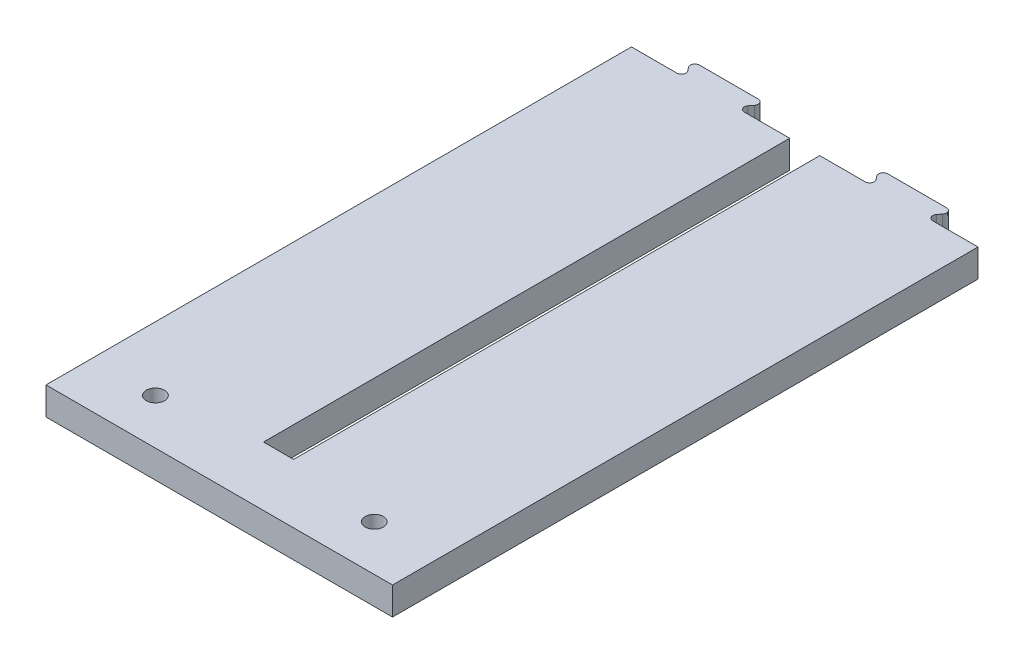
ISO-10303-21;
HEADER;
FILE_DESCRIPTION(('STEP AP214'),'2;1');
FILE_NAME('part.step','',(''),(''),'','','');
FILE_SCHEMA(('AUTOMOTIVE_DESIGN { 1 0 10303 214 1 1 1 1 }'));
ENDSEC;
DATA;
#1=APPLICATION_CONTEXT('core data for automotive mechanical design processes');
#2=APPLICATION_PROTOCOL_DEFINITION('international standard','automotive_design',2000,#1);
#3=PRODUCT_CONTEXT('',#1,'mechanical');
#4=PRODUCT('Part','Part','',(#3));
#5=PRODUCT_RELATED_PRODUCT_CATEGORY('part','',(#4));
#6=PRODUCT_DEFINITION_FORMATION('','',#4);
#7=PRODUCT_DEFINITION_CONTEXT('part definition',#1,'design');
#8=PRODUCT_DEFINITION('design','',#6,#7);
#9=PRODUCT_DEFINITION_SHAPE('','',#8);
#10=(LENGTH_UNIT() NAMED_UNIT(*) SI_UNIT(.MILLI.,.METRE.));
#11=(NAMED_UNIT(*) PLANE_ANGLE_UNIT() SI_UNIT($,.RADIAN.));
#12=(NAMED_UNIT(*) SI_UNIT($,.STERADIAN.) SOLID_ANGLE_UNIT());
#13=UNCERTAINTY_MEASURE_WITH_UNIT(LENGTH_MEASURE(1.E-05),#10,'distance_accuracy_value','');
#14=(GEOMETRIC_REPRESENTATION_CONTEXT(3) GLOBAL_UNCERTAINTY_ASSIGNED_CONTEXT((#13)) GLOBAL_UNIT_ASSIGNED_CONTEXT((#10,
#11,#12)) REPRESENTATION_CONTEXT('',''));
#15=CARTESIAN_POINT('',(0.,0.,0.));
#16=DIRECTION('',(0.,0.,1.));
#17=DIRECTION('',(1.,0.,0.));
#18=AXIS2_PLACEMENT_3D('',#15,#16,#17);
#19=CARTESIAN_POINT('',(-19.,0.,-64.2));
#20=DIRECTION('',(0.,0.,1.));
#21=DIRECTION('',(1.,0.,0.));
#22=AXIS2_PLACEMENT_3D('',#19,#20,#21);
#23=PLANE('',#22);
#24=DIRECTION('',(1.,0.,0.));
#25=VECTOR('',#24,1.);
#26=CARTESIAN_POINT('',(-19.,0.,-64.2));
#27=LINE('',#26,#25);
#28=CARTESIAN_POINT('',(14.0301767927264,0.,-64.2));
#29=VERTEX_POINT('',#28);
#30=CARTESIAN_POINT('',(19.,0.,-64.2));
#31=VERTEX_POINT('',#30);
#32=EDGE_CURVE('E391',#29,#31,#27,.T.);
#33=ORIENTED_EDGE('',*,*,#32,.F.);
#34=DIRECTION('',(0.,1.,0.));
#35=VECTOR('',#34,1.);
#36=CARTESIAN_POINT('',(14.0301767927264,3.05,-64.2));
#37=LINE('',#36,#35);
#38=CARTESIAN_POINT('',(14.0301767927264,3.05,-64.2));
#39=VERTEX_POINT('',#38);
#40=EDGE_CURVE('E285',#29,#39,#37,.T.);
#41=ORIENTED_EDGE('',*,*,#40,.T.);
#42=DIRECTION('',(1.,0.,0.));
#43=VECTOR('',#42,1.);
#44=CARTESIAN_POINT('',(-19.,3.05,-64.2));
#45=LINE('',#44,#43);
#46=CARTESIAN_POINT('',(19.,3.05,-64.2));
#47=VERTEX_POINT('',#46);
#48=EDGE_CURVE('E403',#39,#47,#45,.T.);
#49=ORIENTED_EDGE('',*,*,#48,.T.);
#50=DIRECTION('',(0.,1.,0.));
#51=VECTOR('',#50,1.);
#52=CARTESIAN_POINT('',(19.,0.,-64.2));
#53=LINE('',#52,#51);
#54=EDGE_CURVE('E253',#31,#47,#53,.T.);
#55=ORIENTED_EDGE('',*,*,#54,.F.);
#56=EDGE_LOOP('',(#33,#41,#49,#55));
#57=FACE_BOUND('',#56,.T.);
#58=ADVANCED_FACE('F69',(#57),#23,.F.);
#59=CARTESIAN_POINT('',(1.65,3.05,-64.2));
#60=VERTEX_POINT('',#59);
#61=CARTESIAN_POINT('',(6.61982320727361,3.05,-64.2));
#62=VERTEX_POINT('',#61);
#63=EDGE_CURVE('E394',#60,#62,#45,.T.);
#64=ORIENTED_EDGE('',*,*,#63,.T.);
#65=DIRECTION('',(0.,1.,0.));
#66=VECTOR('',#65,1.);
#67=CARTESIAN_POINT('',(6.61982320727361,0.,-64.2));
#68=LINE('',#67,#66);
#69=CARTESIAN_POINT('',(6.61982320727361,0.,-64.2));
#70=VERTEX_POINT('',#69);
#71=EDGE_CURVE('E344',#62,#70,#68,.F.);
#72=ORIENTED_EDGE('',*,*,#71,.T.);
#73=CARTESIAN_POINT('',(1.65,0.,-64.2));
#74=VERTEX_POINT('',#73);
#75=EDGE_CURVE('E244',#74,#70,#27,.T.);
#76=ORIENTED_EDGE('',*,*,#75,.F.);
#77=DIRECTION('',(0.,-1.,0.));
#78=VECTOR('',#77,1.);
#79=CARTESIAN_POINT('',(1.65,0.,-64.2));
#80=LINE('',#79,#78);
#81=EDGE_CURVE('E281',#60,#74,#80,.T.);
#82=ORIENTED_EDGE('',*,*,#81,.F.);
#83=EDGE_LOOP('',(#64,#72,#76,#82));
#84=FACE_BOUND('',#83,.T.);
#85=ADVANCED_FACE('F540',(#84),#23,.F.);
#86=CARTESIAN_POINT('',(-6.61982320727362,0.,-64.2));
#87=VERTEX_POINT('',#86);
#88=CARTESIAN_POINT('',(-1.65,0.,-64.2));
#89=VERTEX_POINT('',#88);
#90=EDGE_CURVE('E242',#87,#89,#27,.T.);
#91=ORIENTED_EDGE('',*,*,#90,.F.);
#92=DIRECTION('',(0.,1.,0.));
#93=VECTOR('',#92,1.);
#94=CARTESIAN_POINT('',(-6.61982320727362,3.05,-64.2));
#95=LINE('',#94,#93);
#96=CARTESIAN_POINT('',(-6.61982320727362,3.05,-64.2));
#97=VERTEX_POINT('',#96);
#98=EDGE_CURVE('E296',#87,#97,#95,.T.);
#99=ORIENTED_EDGE('',*,*,#98,.T.);
#100=CARTESIAN_POINT('',(-1.65,3.05,-64.2));
#101=VERTEX_POINT('',#100);
#102=EDGE_CURVE('E392',#97,#101,#45,.T.);
#103=ORIENTED_EDGE('',*,*,#102,.T.);
#104=DIRECTION('',(0.,1.,0.));
#105=VECTOR('',#104,1.);
#106=CARTESIAN_POINT('',(-1.65,0.,-64.2));
#107=LINE('',#106,#105);
#108=EDGE_CURVE('E426',#89,#101,#107,.T.);
#109=ORIENTED_EDGE('',*,*,#108,.F.);
#110=EDGE_LOOP('',(#91,#99,#103,#109));
#111=FACE_BOUND('',#110,.T.);
#112=ADVANCED_FACE('F529',(#111),#23,.F.);
#113=CARTESIAN_POINT('',(-19.,3.05,-64.2));
#114=VERTEX_POINT('',#113);
#115=CARTESIAN_POINT('',(-14.0301767927264,3.05,-64.2));
#116=VERTEX_POINT('',#115);
#117=EDGE_CURVE('E385',#114,#116,#45,.T.);
#118=ORIENTED_EDGE('',*,*,#117,.T.);
#119=DIRECTION('',(0.,1.,0.));
#120=VECTOR('',#119,1.);
#121=CARTESIAN_POINT('',(-14.0301767927264,0.,-64.2));
#122=LINE('',#121,#120);
#123=CARTESIAN_POINT('',(-14.0301767927264,0.,-64.2));
#124=VERTEX_POINT('',#123);
#125=EDGE_CURVE('E238',#116,#124,#122,.F.);
#126=ORIENTED_EDGE('',*,*,#125,.T.);
#127=CARTESIAN_POINT('',(-19.,0.,-64.2));
#128=VERTEX_POINT('',#127);
#129=EDGE_CURVE('E231',#128,#124,#27,.T.);
#130=ORIENTED_EDGE('',*,*,#129,.F.);
#131=DIRECTION('',(0.,1.,0.));
#132=VECTOR('',#131,1.);
#133=CARTESIAN_POINT('',(-19.,0.,-64.2));
#134=LINE('',#133,#132);
#135=EDGE_CURVE('E235',#128,#114,#134,.T.);
#136=ORIENTED_EDGE('',*,*,#135,.T.);
#137=EDGE_LOOP('',(#118,#126,#130,#136));
#138=FACE_BOUND('',#137,.T.);
#139=ADVANCED_FACE('F234',(#138),#23,.F.);
#140=CARTESIAN_POINT('',(0.,3.05,0.));
#141=DIRECTION('',(0.,1.,0.));
#142=DIRECTION('',(0.,0.,1.));
#143=AXIS2_PLACEMENT_3D('',#140,#141,#142);
#144=PLANE('',#143);
#145=DIRECTION('',(-0.618688597809045,0.,0.785636314678159));
#146=VECTOR('',#145,1.);
#147=CARTESIAN_POINT('',(-23.1814061143793,3.05,-18.2553573150735));
#148=LINE('',#147,#146);
#149=CARTESIAN_POINT('',(13.9376413646127,3.05,-65.3906557010955));
#150=VERTEX_POINT('',#149);
#151=CARTESIAN_POINT('',(13.6373586353873,3.05,-65.0093442989045));
#152=VERTEX_POINT('',#151);
#153=EDGE_CURVE('E497',#150,#152,#148,.T.);
#154=ORIENTED_EDGE('',*,*,#153,.F.);
#155=CARTESIAN_POINT('',(13.5448232072736,3.05,-65.7));
#156=DIRECTION('',(0.,1.,0.));
#157=DIRECTION('',(0.,0.,1.));
#158=AXIS2_PLACEMENT_3D('',#155,#156,#157);
#159=CIRCLE('',#158,0.5);
#160=CARTESIAN_POINT('',(13.5448232072736,3.05,-66.2));
#161=VERTEX_POINT('',#160);
#162=EDGE_CURVE('E316',#150,#161,#159,.T.);
#163=ORIENTED_EDGE('',*,*,#162,.T.);
#164=DIRECTION('',(1.,0.,0.));
#165=VECTOR('',#164,1.);
#166=CARTESIAN_POINT('',(0.,3.05,-66.2));
#167=LINE('',#166,#165);
#168=CARTESIAN_POINT('',(7.10517679272638,3.05,-66.2));
#169=VERTEX_POINT('',#168);
#170=EDGE_CURVE('E504',#169,#161,#167,.T.);
#171=ORIENTED_EDGE('',*,*,#170,.F.);
#172=CARTESIAN_POINT('',(7.10517679272638,3.05,-65.7));
#173=DIRECTION('',(0.,1.,0.));
#174=DIRECTION('',(0.,0.,1.));
#175=AXIS2_PLACEMENT_3D('',#172,#173,#174);
#176=CIRCLE('',#175,0.5);
#177=CARTESIAN_POINT('',(6.7123586353873,3.05,-65.3906557010955));
#178=VERTEX_POINT('',#177);
#179=EDGE_CURVE('E313',#169,#178,#176,.T.);
#180=ORIENTED_EDGE('',*,*,#179,.T.);
#181=DIRECTION('',(-0.618688597809051,0.,-0.785636314678154));
#182=VECTOR('',#181,1.);
#183=CARTESIAN_POINT('',(35.9270903655126,3.05,-28.2925836628414));
#184=LINE('',#183,#182);
#185=CARTESIAN_POINT('',(7.01264136461267,3.05,-65.0093442989045));
#186=VERTEX_POINT('',#185);
#187=EDGE_CURVE('E508',#186,#178,#184,.T.);
#188=ORIENTED_EDGE('',*,*,#187,.F.);
#189=CARTESIAN_POINT('',(6.61982320727361,3.05,-64.7));
#190=DIRECTION('',(0.,1.,0.));
#191=DIRECTION('',(0.,0.,1.));
#192=AXIS2_PLACEMENT_3D('',#189,#190,#191);
#193=CIRCLE('',#192,0.5);
#194=EDGE_CURVE('E375',#186,#62,#193,.F.);
#195=ORIENTED_EDGE('',*,*,#194,.T.);
#196=ORIENTED_EDGE('',*,*,#63,.F.);
#197=DIRECTION('',(0.,0.,-1.));
#198=VECTOR('',#197,1.);
#199=CARTESIAN_POINT('',(1.65,3.05,0.));
#200=LINE('',#199,#198);
#201=CARTESIAN_POINT('',(1.65,3.05,-6.5));
#202=VERTEX_POINT('',#201);
#203=EDGE_CURVE('E463',#202,#60,#200,.T.);
#204=ORIENTED_EDGE('',*,*,#203,.F.);
#205=DIRECTION('',(1.,0.,0.));
#206=VECTOR('',#205,1.);
#207=CARTESIAN_POINT('',(0.,3.05,-6.5));
#208=LINE('',#207,#206);
#209=CARTESIAN_POINT('',(-1.65,3.05,-6.5));
#210=VERTEX_POINT('',#209);
#211=EDGE_CURVE('E436',#210,#202,#208,.T.);
#212=ORIENTED_EDGE('',*,*,#211,.F.);
#213=DIRECTION('',(0.,0.,1.));
#214=VECTOR('',#213,1.);
#215=CARTESIAN_POINT('',(-1.65,3.05,0.));
#216=LINE('',#215,#214);
#217=EDGE_CURVE('E453',#101,#210,#216,.T.);
#218=ORIENTED_EDGE('',*,*,#217,.F.);
#219=ORIENTED_EDGE('',*,*,#102,.F.);
#220=CARTESIAN_POINT('',(-6.61982320727362,3.05,-64.7));
#221=DIRECTION('',(0.,1.,0.));
#222=DIRECTION('',(0.,0.,1.));
#223=AXIS2_PLACEMENT_3D('',#220,#221,#222);
#224=CIRCLE('',#223,0.5);
#225=CARTESIAN_POINT('',(-7.0126413646127,3.05,-65.0093442989045));
#226=VERTEX_POINT('',#225);
#227=EDGE_CURVE('E369',#97,#226,#224,.F.);
#228=ORIENTED_EDGE('',*,*,#227,.T.);
#229=DIRECTION('',(-0.618688597809045,0.,0.785636314678159));
#230=VECTOR('',#229,1.);
#231=CARTESIAN_POINT('',(-35.9270903655126,3.05,-28.2925836628409));
#232=LINE('',#231,#230);
#233=CARTESIAN_POINT('',(-6.71235863538732,3.05,-65.3906557010955));
#234=VERTEX_POINT('',#233);
#235=EDGE_CURVE('E413',#234,#226,#232,.T.);
#236=ORIENTED_EDGE('',*,*,#235,.F.);
#237=CARTESIAN_POINT('',(-7.10517679272641,3.05,-65.7));
#238=DIRECTION('',(0.,1.,0.));
#239=DIRECTION('',(0.,0.,1.));
#240=AXIS2_PLACEMENT_3D('',#237,#238,#239);
#241=CIRCLE('',#240,0.5);
#242=CARTESIAN_POINT('',(-7.10517679272641,3.05,-66.2));
#243=VERTEX_POINT('',#242);
#244=EDGE_CURVE('E310',#234,#243,#241,.T.);
#245=ORIENTED_EDGE('',*,*,#244,.T.);
#246=DIRECTION('',(1.,0.,0.));
#247=VECTOR('',#246,1.);
#248=CARTESIAN_POINT('',(0.,3.05,-66.2));
#249=LINE('',#248,#247);
#250=CARTESIAN_POINT('',(-13.5448232072736,3.05,-66.2));
#251=VERTEX_POINT('',#250);
#252=EDGE_CURVE('E417',#251,#243,#249,.T.);
#253=ORIENTED_EDGE('',*,*,#252,.F.);
#254=CARTESIAN_POINT('',(-13.5448232072736,3.05,-65.7));
#255=DIRECTION('',(0.,1.,0.));
#256=DIRECTION('',(0.,0.,1.));
#257=AXIS2_PLACEMENT_3D('',#254,#255,#256);
#258=CIRCLE('',#257,0.5);
#259=CARTESIAN_POINT('',(-13.9376413646127,3.05,-65.3906557010955));
#260=VERTEX_POINT('',#259);
#261=EDGE_CURVE('E307',#251,#260,#258,.T.);
#262=ORIENTED_EDGE('',*,*,#261,.T.);
#263=DIRECTION('',(-0.618688597809045,0.,-0.785636314678159));
#264=VECTOR('',#263,1.);
#265=CARTESIAN_POINT('',(23.1814061143793,3.05,-18.2553573150735));
#266=LINE('',#265,#264);
#267=CARTESIAN_POINT('',(-13.6373586353873,3.05,-65.0093442989045));
#268=VERTEX_POINT('',#267);
#269=EDGE_CURVE('E387',#268,#260,#266,.T.);
#270=ORIENTED_EDGE('',*,*,#269,.F.);
#271=CARTESIAN_POINT('',(-14.0301767927264,3.05,-64.7));
#272=DIRECTION('',(0.,1.,0.));
#273=DIRECTION('',(0.,0.,1.));
#274=AXIS2_PLACEMENT_3D('',#271,#272,#273);
#275=CIRCLE('',#274,0.5);
#276=EDGE_CURVE('E78',#268,#116,#275,.F.);
#277=ORIENTED_EDGE('',*,*,#276,.T.);
#278=ORIENTED_EDGE('',*,*,#117,.F.);
#279=DIRECTION('',(0.,0.,-1.));
#280=VECTOR('',#279,1.);
#281=CARTESIAN_POINT('',(-19.,3.05,0.));
#282=LINE('',#281,#280);
#283=CARTESIAN_POINT('',(-19.,3.05,0.));
#284=VERTEX_POINT('',#283);
#285=EDGE_CURVE('E251',#284,#114,#282,.T.);
#286=ORIENTED_EDGE('',*,*,#285,.F.);
#287=DIRECTION('',(1.,0.,0.));
#288=VECTOR('',#287,1.);
#289=CARTESIAN_POINT('',(0.,3.05,0.));
#290=LINE('',#289,#288);
#291=CARTESIAN_POINT('',(19.,3.05,0.));
#292=VERTEX_POINT('',#291);
#293=EDGE_CURVE('E262',#284,#292,#290,.T.);
#294=ORIENTED_EDGE('',*,*,#293,.T.);
#295=DIRECTION('',(0.,0.,-1.));
#296=VECTOR('',#295,1.);
#297=CARTESIAN_POINT('',(19.,3.05,0.));
#298=LINE('',#297,#296);
#299=EDGE_CURVE('E268',#292,#47,#298,.T.);
#300=ORIENTED_EDGE('',*,*,#299,.T.);
#301=ORIENTED_EDGE('',*,*,#48,.F.);
#302=CARTESIAN_POINT('',(14.0301767927264,3.05,-64.7));
#303=DIRECTION('',(0.,1.,0.));
#304=DIRECTION('',(0.,0.,1.));
#305=AXIS2_PLACEMENT_3D('',#302,#303,#304);
#306=CIRCLE('',#305,0.5);
#307=EDGE_CURVE('E363',#39,#152,#306,.F.);
#308=ORIENTED_EDGE('',*,*,#307,.T.);
#309=EDGE_LOOP('',(#154,#163,#171,#180,#188,#195,#196,#204,#212,#218,#219,#228,#236,#245,#253,
#262,#270,#277,#278,#286,#294,#300,#301,#308));
#310=FACE_BOUND('',#309,.T.);
#311=CARTESIAN_POINT('',(12.,3.05,-5.));
#312=DIRECTION('',(0.,-1.,0.));
#313=DIRECTION('',(0.,0.,-1.));
#314=AXIS2_PLACEMENT_3D('',#311,#312,#313);
#315=CIRCLE('',#314,1.);
#316=CARTESIAN_POINT('',(12.,3.05,-6.));
#317=VERTEX_POINT('',#316);
#318=EDGE_CURVE('E441',#317,#317,#315,.T.);
#319=ORIENTED_EDGE('',*,*,#318,.T.);
#320=EDGE_LOOP('',(#319));
#321=FACE_BOUND('',#320,.T.);
#322=CARTESIAN_POINT('',(-12.,3.05,-5.));
#323=DIRECTION('',(0.,1.,0.));
#324=DIRECTION('',(0.,0.,1.));
#325=AXIS2_PLACEMENT_3D('',#322,#323,#324);
#326=CIRCLE('',#325,1.);
#327=CARTESIAN_POINT('',(-12.,3.05,-4.));
#328=VERTEX_POINT('',#327);
#329=EDGE_CURVE('E437',#328,#328,#326,.T.);
#330=ORIENTED_EDGE('',*,*,#329,.F.);
#331=EDGE_LOOP('',(#330));
#332=FACE_BOUND('',#331,.T.);
#333=ADVANCED_FACE('F383',(#310,#321,#332),#144,.T.);
#334=CARTESIAN_POINT('',(0.,0.,0.));
#335=DIRECTION('',(0.,1.,0.));
#336=DIRECTION('',(0.,0.,1.));
#337=AXIS2_PLACEMENT_3D('',#334,#335,#336);
#338=PLANE('',#337);
#339=DIRECTION('',(1.,0.,0.));
#340=VECTOR('',#339,1.);
#341=CARTESIAN_POINT('',(0.,0.,-66.2));
#342=LINE('',#341,#340);
#343=CARTESIAN_POINT('',(7.10517679272638,0.,-66.2));
#344=VERTEX_POINT('',#343);
#345=CARTESIAN_POINT('',(13.5448232072736,0.,-66.2));
#346=VERTEX_POINT('',#345);
#347=EDGE_CURVE('E556',#344,#346,#342,.T.);
#348=ORIENTED_EDGE('',*,*,#347,.T.);
#349=CARTESIAN_POINT('',(13.5448232072736,0.,-65.7));
#350=DIRECTION('',(0.,1.,0.));
#351=DIRECTION('',(0.,0.,1.));
#352=AXIS2_PLACEMENT_3D('',#349,#350,#351);
#353=CIRCLE('',#352,0.5);
#354=CARTESIAN_POINT('',(13.9376413646127,0.,-65.3906557010955));
#355=VERTEX_POINT('',#354);
#356=EDGE_CURVE('E335',#346,#355,#353,.F.);
#357=ORIENTED_EDGE('',*,*,#356,.T.);
#358=DIRECTION('',(-0.618688597809045,0.,0.785636314678159));
#359=VECTOR('',#358,1.);
#360=CARTESIAN_POINT('',(-23.1814061143793,0.,-18.2553573150735));
#361=LINE('',#360,#359);
#362=CARTESIAN_POINT('',(13.6373586353873,0.,-65.0093442989045));
#363=VERTEX_POINT('',#362);
#364=EDGE_CURVE('E514',#355,#363,#361,.T.);
#365=ORIENTED_EDGE('',*,*,#364,.T.);
#366=CARTESIAN_POINT('',(14.0301767927264,0.,-64.7));
#367=DIRECTION('',(0.,1.,0.));
#368=DIRECTION('',(0.,0.,1.));
#369=AXIS2_PLACEMENT_3D('',#366,#367,#368);
#370=CIRCLE('',#369,0.5);
#371=EDGE_CURVE('E366',#363,#29,#370,.T.);
#372=ORIENTED_EDGE('',*,*,#371,.T.);
#373=ORIENTED_EDGE('',*,*,#32,.T.);
#374=DIRECTION('',(0.,0.,-1.));
#375=VECTOR('',#374,1.);
#376=CARTESIAN_POINT('',(19.,0.,0.));
#377=LINE('',#376,#375);
#378=CARTESIAN_POINT('',(19.,0.,0.));
#379=VERTEX_POINT('',#378);
#380=EDGE_CURVE('E263',#379,#31,#377,.T.);
#381=ORIENTED_EDGE('',*,*,#380,.F.);
#382=DIRECTION('',(1.,0.,0.));
#383=VECTOR('',#382,1.);
#384=CARTESIAN_POINT('',(0.,0.,0.));
#385=LINE('',#384,#383);
#386=CARTESIAN_POINT('',(-19.,0.,0.));
#387=VERTEX_POINT('',#386);
#388=EDGE_CURVE('E260',#387,#379,#385,.T.);
#389=ORIENTED_EDGE('',*,*,#388,.F.);
#390=DIRECTION('',(0.,0.,-1.));
#391=VECTOR('',#390,1.);
#392=CARTESIAN_POINT('',(-19.,0.,0.));
#393=LINE('',#392,#391);
#394=EDGE_CURVE('E249',#387,#128,#393,.T.);
#395=ORIENTED_EDGE('',*,*,#394,.T.);
#396=ORIENTED_EDGE('',*,*,#129,.T.);
#397=CARTESIAN_POINT('',(-14.0301767927264,0.,-64.7));
#398=DIRECTION('',(0.,1.,0.));
#399=DIRECTION('',(0.,0.,1.));
#400=AXIS2_PLACEMENT_3D('',#397,#398,#399);
#401=CIRCLE('',#400,0.5);
#402=CARTESIAN_POINT('',(-13.6373586353873,0.,-65.0093442989045));
#403=VERTEX_POINT('',#402);
#404=EDGE_CURVE('E12',#124,#403,#401,.T.);
#405=ORIENTED_EDGE('',*,*,#404,.T.);
#406=DIRECTION('',(-0.618688597809045,0.,-0.785636314678159));
#407=VECTOR('',#406,1.);
#408=CARTESIAN_POINT('',(23.1814061143793,0.,-18.2553573150735));
#409=LINE('',#408,#407);
#410=CARTESIAN_POINT('',(-13.9376413646127,0.,-65.3906557010955));
#411=VERTEX_POINT('',#410);
#412=EDGE_CURVE('E397',#403,#411,#409,.T.);
#413=ORIENTED_EDGE('',*,*,#412,.T.);
#414=CARTESIAN_POINT('',(-13.5448232072736,0.,-65.7));
#415=DIRECTION('',(0.,1.,0.));
#416=DIRECTION('',(0.,0.,1.));
#417=AXIS2_PLACEMENT_3D('',#414,#415,#416);
#418=CIRCLE('',#417,0.5);
#419=CARTESIAN_POINT('',(-13.5448232072736,0.,-66.2));
#420=VERTEX_POINT('',#419);
#421=EDGE_CURVE('E326',#411,#420,#418,.F.);
#422=ORIENTED_EDGE('',*,*,#421,.T.);
#423=DIRECTION('',(1.,0.,0.));
#424=VECTOR('',#423,1.);
#425=CARTESIAN_POINT('',(0.,0.,-66.2));
#426=LINE('',#425,#424);
#427=CARTESIAN_POINT('',(-7.10517679272641,0.,-66.2));
#428=VERTEX_POINT('',#427);
#429=EDGE_CURVE('E404',#420,#428,#426,.T.);
#430=ORIENTED_EDGE('',*,*,#429,.T.);
#431=CARTESIAN_POINT('',(-7.10517679272641,0.,-65.7));
#432=DIRECTION('',(0.,1.,0.));
#433=DIRECTION('',(0.,0.,1.));
#434=AXIS2_PLACEMENT_3D('',#431,#432,#433);
#435=CIRCLE('',#434,0.5);
#436=CARTESIAN_POINT('',(-6.71235863538732,0.,-65.3906557010955));
#437=VERTEX_POINT('',#436);
#438=EDGE_CURVE('E329',#428,#437,#435,.F.);
#439=ORIENTED_EDGE('',*,*,#438,.T.);
#440=DIRECTION('',(-0.618688597809045,0.,0.785636314678159));
#441=VECTOR('',#440,1.);
#442=CARTESIAN_POINT('',(-35.9270903655126,0.,-28.2925836628409));
#443=LINE('',#442,#441);
#444=CARTESIAN_POINT('',(-7.0126413646127,0.,-65.0093442989045));
#445=VERTEX_POINT('',#444);
#446=EDGE_CURVE('E409',#437,#445,#443,.T.);
#447=ORIENTED_EDGE('',*,*,#446,.T.);
#448=CARTESIAN_POINT('',(-6.61982320727362,0.,-64.7));
#449=DIRECTION('',(0.,1.,0.));
#450=DIRECTION('',(0.,0.,1.));
#451=AXIS2_PLACEMENT_3D('',#448,#449,#450);
#452=CIRCLE('',#451,0.5);
#453=EDGE_CURVE('E372',#445,#87,#452,.T.);
#454=ORIENTED_EDGE('',*,*,#453,.T.);
#455=ORIENTED_EDGE('',*,*,#90,.T.);
#456=DIRECTION('',(0.,0.,1.));
#457=VECTOR('',#456,1.);
#458=CARTESIAN_POINT('',(-1.65,0.,0.));
#459=LINE('',#458,#457);
#460=CARTESIAN_POINT('',(-1.65,0.,-6.5));
#461=VERTEX_POINT('',#460);
#462=EDGE_CURVE('E457',#89,#461,#459,.T.);
#463=ORIENTED_EDGE('',*,*,#462,.T.);
#464=DIRECTION('',(1.,0.,0.));
#465=VECTOR('',#464,1.);
#466=CARTESIAN_POINT('',(0.,0.,-6.5));
#467=LINE('',#466,#465);
#468=CARTESIAN_POINT('',(1.65,0.,-6.5));
#469=VERTEX_POINT('',#468);
#470=EDGE_CURVE('E448',#461,#469,#467,.T.);
#471=ORIENTED_EDGE('',*,*,#470,.T.);
#472=DIRECTION('',(0.,0.,-1.));
#473=VECTOR('',#472,1.);
#474=CARTESIAN_POINT('',(1.65,0.,0.));
#475=LINE('',#474,#473);
#476=EDGE_CURVE('E452',#469,#74,#475,.T.);
#477=ORIENTED_EDGE('',*,*,#476,.T.);
#478=ORIENTED_EDGE('',*,*,#75,.T.);
#479=CARTESIAN_POINT('',(6.61982320727361,0.,-64.7));
#480=DIRECTION('',(0.,1.,0.));
#481=DIRECTION('',(0.,0.,1.));
#482=AXIS2_PLACEMENT_3D('',#479,#480,#481);
#483=CIRCLE('',#482,0.5);
#484=CARTESIAN_POINT('',(7.01264136461267,0.,-65.0093442989045));
#485=VERTEX_POINT('',#484);
#486=EDGE_CURVE('E92',#70,#485,#483,.T.);
#487=ORIENTED_EDGE('',*,*,#486,.T.);
#488=DIRECTION('',(-0.618688597809051,0.,-0.785636314678154));
#489=VECTOR('',#488,1.);
#490=CARTESIAN_POINT('',(35.9270903655126,0.,-28.2925836628414));
#491=LINE('',#490,#489);
#492=CARTESIAN_POINT('',(6.7123586353873,0.,-65.3906557010955));
#493=VERTEX_POINT('',#492);
#494=EDGE_CURVE('E418',#485,#493,#491,.T.);
#495=ORIENTED_EDGE('',*,*,#494,.T.);
#496=CARTESIAN_POINT('',(7.10517679272638,0.,-65.7));
#497=DIRECTION('',(0.,1.,0.));
#498=DIRECTION('',(0.,0.,1.));
#499=AXIS2_PLACEMENT_3D('',#496,#497,#498);
#500=CIRCLE('',#499,0.5);
#501=EDGE_CURVE('E332',#493,#344,#500,.F.);
#502=ORIENTED_EDGE('',*,*,#501,.T.);
#503=EDGE_LOOP('',(#348,#357,#365,#372,#373,#381,#389,#395,#396,#405,#413,#422,#430,#439,#447,
#454,#455,#463,#471,#477,#478,#487,#495,#502));
#504=FACE_BOUND('',#503,.T.);
#505=CARTESIAN_POINT('',(12.,0.,-5.));
#506=DIRECTION('',(0.,-1.,0.));
#507=DIRECTION('',(0.,0.,-1.));
#508=AXIS2_PLACEMENT_3D('',#505,#506,#507);
#509=CIRCLE('',#508,1.);
#510=CARTESIAN_POINT('',(12.,0.,-6.));
#511=VERTEX_POINT('',#510);
#512=EDGE_CURVE('E431',#511,#511,#509,.T.);
#513=ORIENTED_EDGE('',*,*,#512,.F.);
#514=EDGE_LOOP('',(#513));
#515=FACE_BOUND('',#514,.T.);
#516=CARTESIAN_POINT('',(-12.,0.,-5.));
#517=DIRECTION('',(0.,1.,0.));
#518=DIRECTION('',(0.,0.,1.));
#519=AXIS2_PLACEMENT_3D('',#516,#517,#518);
#520=CIRCLE('',#519,1.);
#521=CARTESIAN_POINT('',(-12.,0.,-4.));
#522=VERTEX_POINT('',#521);
#523=EDGE_CURVE('E432',#522,#522,#520,.T.);
#524=ORIENTED_EDGE('',*,*,#523,.T.);
#525=EDGE_LOOP('',(#524));
#526=FACE_BOUND('',#525,.T.);
#527=ADVANCED_FACE('F257',(#504,#515,#526),#338,.F.);
#528=CARTESIAN_POINT('',(0.,3.05,0.));
#529=DIRECTION('',(0.,0.,-1.));
#530=DIRECTION('',(-1.,0.,0.));
#531=AXIS2_PLACEMENT_3D('',#528,#529,#530);
#532=PLANE('',#531);
#533=ORIENTED_EDGE('',*,*,#388,.T.);
#534=DIRECTION('',(0.,-1.,0.));
#535=VECTOR('',#534,1.);
#536=CARTESIAN_POINT('',(19.,3.05,0.));
#537=LINE('',#536,#535);
#538=EDGE_CURVE('E277',#292,#379,#537,.T.);
#539=ORIENTED_EDGE('',*,*,#538,.F.);
#540=ORIENTED_EDGE('',*,*,#293,.F.);
#541=DIRECTION('',(0.,-1.,0.));
#542=VECTOR('',#541,1.);
#543=CARTESIAN_POINT('',(-19.,3.05,0.));
#544=LINE('',#543,#542);
#545=EDGE_CURVE('E274',#284,#387,#544,.T.);
#546=ORIENTED_EDGE('',*,*,#545,.T.);
#547=EDGE_LOOP('',(#533,#539,#540,#546));
#548=FACE_BOUND('',#547,.T.);
#549=ADVANCED_FACE('F483',(#548),#532,.F.);
#550=CARTESIAN_POINT('',(19.,3.05,0.));
#551=DIRECTION('',(-1.,0.,0.));
#552=DIRECTION('',(0.,0.,1.));
#553=AXIS2_PLACEMENT_3D('',#550,#551,#552);
#554=PLANE('',#553);
#555=ORIENTED_EDGE('',*,*,#380,.T.);
#556=ORIENTED_EDGE('',*,*,#54,.T.);
#557=ORIENTED_EDGE('',*,*,#299,.F.);
#558=ORIENTED_EDGE('',*,*,#538,.T.);
#559=EDGE_LOOP('',(#555,#556,#557,#558));
#560=FACE_BOUND('',#559,.T.);
#561=ADVANCED_FACE('F487',(#560),#554,.F.);
#562=CARTESIAN_POINT('',(-19.,3.05,0.));
#563=DIRECTION('',(-1.,0.,0.));
#564=DIRECTION('',(0.,0.,1.));
#565=AXIS2_PLACEMENT_3D('',#562,#563,#564);
#566=PLANE('',#565);
#567=ORIENTED_EDGE('',*,*,#135,.F.);
#568=ORIENTED_EDGE('',*,*,#394,.F.);
#569=ORIENTED_EDGE('',*,*,#545,.F.);
#570=ORIENTED_EDGE('',*,*,#285,.T.);
#571=EDGE_LOOP('',(#567,#568,#569,#570));
#572=FACE_BOUND('',#571,.T.);
#573=ADVANCED_FACE('F248',(#572),#566,.T.);
#574=CARTESIAN_POINT('',(0.,0.,-6.5));
#575=DIRECTION('',(0.,0.,1.));
#576=DIRECTION('',(1.,0.,0.));
#577=AXIS2_PLACEMENT_3D('',#574,#575,#576);
#578=PLANE('',#577);
#579=ORIENTED_EDGE('',*,*,#211,.T.);
#580=DIRECTION('',(0.,1.,0.));
#581=VECTOR('',#580,1.);
#582=CARTESIAN_POINT('',(1.65,0.,-6.5));
#583=LINE('',#582,#581);
#584=EDGE_CURVE('E460',#469,#202,#583,.T.);
#585=ORIENTED_EDGE('',*,*,#584,.F.);
#586=ORIENTED_EDGE('',*,*,#470,.F.);
#587=DIRECTION('',(0.,1.,0.));
#588=VECTOR('',#587,1.);
#589=CARTESIAN_POINT('',(-1.65,0.,-6.5));
#590=LINE('',#589,#588);
#591=EDGE_CURVE('E469',#461,#210,#590,.T.);
#592=ORIENTED_EDGE('',*,*,#591,.T.);
#593=EDGE_LOOP('',(#579,#585,#586,#592));
#594=FACE_BOUND('',#593,.T.);
#595=ADVANCED_FACE('F592',(#594),#578,.F.);
#596=CARTESIAN_POINT('',(-1.65,0.,0.));
#597=DIRECTION('',(-1.,0.,0.));
#598=DIRECTION('',(0.,0.,1.));
#599=AXIS2_PLACEMENT_3D('',#596,#597,#598);
#600=PLANE('',#599);
#601=ORIENTED_EDGE('',*,*,#462,.F.);
#602=ORIENTED_EDGE('',*,*,#108,.T.);
#603=ORIENTED_EDGE('',*,*,#217,.T.);
#604=ORIENTED_EDGE('',*,*,#591,.F.);
#605=EDGE_LOOP('',(#601,#602,#603,#604));
#606=FACE_BOUND('',#605,.T.);
#607=ADVANCED_FACE('F744',(#606),#600,.F.);
#608=CARTESIAN_POINT('',(1.65,0.,0.));
#609=DIRECTION('',(1.,0.,0.));
#610=DIRECTION('',(0.,0.,-1.));
#611=AXIS2_PLACEMENT_3D('',#608,#609,#610);
#612=PLANE('',#611);
#613=ORIENTED_EDGE('',*,*,#203,.T.);
#614=ORIENTED_EDGE('',*,*,#81,.T.);
#615=ORIENTED_EDGE('',*,*,#476,.F.);
#616=ORIENTED_EDGE('',*,*,#584,.T.);
#617=EDGE_LOOP('',(#613,#614,#615,#616));
#618=FACE_BOUND('',#617,.T.);
#619=ADVANCED_FACE('F739',(#618),#612,.F.);
#620=CARTESIAN_POINT('',(12.,0.,-5.));
#621=DIRECTION('',(0.,1.,0.));
#622=DIRECTION('',(0.,0.,1.));
#623=AXIS2_PLACEMENT_3D('',#620,#621,#622);
#624=CYLINDRICAL_SURFACE('',#623,1.);
#625=ORIENTED_EDGE('',*,*,#512,.T.);
#626=EDGE_LOOP('',(#625));
#627=FACE_BOUND('',#626,.T.);
#628=ORIENTED_EDGE('',*,*,#318,.F.);
#629=EDGE_LOOP('',(#628));
#630=FACE_BOUND('',#629,.T.);
#631=ADVANCED_FACE('F624',(#627,#630),#624,.F.);
#632=CARTESIAN_POINT('',(-12.,0.,-5.));
#633=DIRECTION('',(0.,1.,0.));
#634=DIRECTION('',(0.,0.,1.));
#635=AXIS2_PLACEMENT_3D('',#632,#633,#634);
#636=CYLINDRICAL_SURFACE('',#635,1.);
#637=ORIENTED_EDGE('',*,*,#523,.F.);
#638=EDGE_LOOP('',(#637));
#639=FACE_BOUND('',#638,.T.);
#640=ORIENTED_EDGE('',*,*,#329,.T.);
#641=EDGE_LOOP('',(#640));
#642=FACE_BOUND('',#641,.T.);
#643=ADVANCED_FACE('F620',(#639,#642),#636,.F.);
#644=CARTESIAN_POINT('',(-35.9270903655126,0.,-28.2925836628409));
#645=DIRECTION('',(-0.785636314678158,0.,-0.618688597809044));
#646=DIRECTION('',(-0.618688597809045,0.,0.785636314678159));
#647=AXIS2_PLACEMENT_3D('',#644,#645,#646);
#648=PLANE('',#647);
#649=ORIENTED_EDGE('',*,*,#235,.T.);
#650=DIRECTION('',(0.,1.,0.));
#651=VECTOR('',#650,1.);
#652=CARTESIAN_POINT('',(-7.0126413646127,0.,-65.0093442989045));
#653=LINE('',#652,#651);
#654=EDGE_CURVE('E304',#226,#445,#653,.F.);
#655=ORIENTED_EDGE('',*,*,#654,.T.);
#656=ORIENTED_EDGE('',*,*,#446,.F.);
#657=DIRECTION('',(0.,1.,0.));
#658=VECTOR('',#657,1.);
#659=CARTESIAN_POINT('',(-6.71235863538732,0.,-65.3906557010955));
#660=LINE('',#659,#658);
#661=EDGE_CURVE('E300',#437,#234,#660,.T.);
#662=ORIENTED_EDGE('',*,*,#661,.T.);
#663=EDGE_LOOP('',(#649,#655,#656,#662));
#664=FACE_BOUND('',#663,.T.);
#665=ADVANCED_FACE('F616',(#664),#648,.F.);
#666=CARTESIAN_POINT('',(23.1814061143793,0.,-18.2553573150735));
#667=DIRECTION('',(0.785636314678158,0.,-0.618688597809044));
#668=DIRECTION('',(-0.618688597809045,0.,-0.785636314678159));
#669=AXIS2_PLACEMENT_3D('',#666,#667,#668);
#670=PLANE('',#669);
#671=ORIENTED_EDGE('',*,*,#269,.T.);
#672=DIRECTION('',(0.,1.,0.));
#673=VECTOR('',#672,1.);
#674=CARTESIAN_POINT('',(-13.9376413646127,0.,-65.3906557010955));
#675=LINE('',#674,#673);
#676=EDGE_CURVE('E358',#260,#411,#675,.F.);
#677=ORIENTED_EDGE('',*,*,#676,.T.);
#678=ORIENTED_EDGE('',*,*,#412,.F.);
#679=DIRECTION('',(0.,1.,0.));
#680=VECTOR('',#679,1.);
#681=CARTESIAN_POINT('',(-13.6373586353873,3.05,-65.0093442989045));
#682=LINE('',#681,#680);
#683=EDGE_CURVE('E354',#403,#268,#682,.T.);
#684=ORIENTED_EDGE('',*,*,#683,.T.);
#685=EDGE_LOOP('',(#671,#677,#678,#684));
#686=FACE_BOUND('',#685,.T.);
#687=ADVANCED_FACE('F400',(#686),#670,.F.);
#688=CARTESIAN_POINT('',(0.,0.,-66.2));
#689=DIRECTION('',(0.,0.,1.));
#690=DIRECTION('',(1.,0.,0.));
#691=AXIS2_PLACEMENT_3D('',#688,#689,#690);
#692=PLANE('',#691);
#693=ORIENTED_EDGE('',*,*,#252,.T.);
#694=DIRECTION('',(0.,1.,0.));
#695=VECTOR('',#694,1.);
#696=CARTESIAN_POINT('',(-7.10517679272641,0.,-66.2));
#697=LINE('',#696,#695);
#698=EDGE_CURVE('E351',#243,#428,#697,.F.);
#699=ORIENTED_EDGE('',*,*,#698,.T.);
#700=ORIENTED_EDGE('',*,*,#429,.F.);
#701=DIRECTION('',(0.,1.,0.));
#702=VECTOR('',#701,1.);
#703=CARTESIAN_POINT('',(-13.5448232072736,0.,-66.2));
#704=LINE('',#703,#702);
#705=EDGE_CURVE('E347',#420,#251,#704,.T.);
#706=ORIENTED_EDGE('',*,*,#705,.T.);
#707=EDGE_LOOP('',(#693,#699,#700,#706));
#708=FACE_BOUND('',#707,.T.);
#709=ADVANCED_FACE('F613',(#708),#692,.F.);
#710=CARTESIAN_POINT('',(-23.1814061143793,0.,-18.2553573150735));
#711=DIRECTION('',(-0.785636314678158,0.,-0.618688597809044));
#712=DIRECTION('',(-0.618688597809045,0.,0.785636314678159));
#713=AXIS2_PLACEMENT_3D('',#710,#711,#712);
#714=PLANE('',#713);
#715=ORIENTED_EDGE('',*,*,#153,.T.);
#716=DIRECTION('',(0.,1.,0.));
#717=VECTOR('',#716,1.);
#718=CARTESIAN_POINT('',(13.6373586353873,0.,-65.0093442989045));
#719=LINE('',#718,#717);
#720=EDGE_CURVE('E293',#152,#363,#719,.F.);
#721=ORIENTED_EDGE('',*,*,#720,.T.);
#722=ORIENTED_EDGE('',*,*,#364,.F.);
#723=DIRECTION('',(0.,1.,0.));
#724=VECTOR('',#723,1.);
#725=CARTESIAN_POINT('',(13.9376413646127,0.,-65.3906557010955));
#726=LINE('',#725,#724);
#727=EDGE_CURVE('E289',#355,#150,#726,.T.);
#728=ORIENTED_EDGE('',*,*,#727,.T.);
#729=EDGE_LOOP('',(#715,#721,#722,#728));
#730=FACE_BOUND('',#729,.T.);
#731=ADVANCED_FACE('F499',(#730),#714,.F.);
#732=CARTESIAN_POINT('',(35.9270903655126,0.,-28.2925836628414));
#733=DIRECTION('',(0.785636314678153,0.,-0.618688597809051));
#734=DIRECTION('',(-0.618688597809051,0.,-0.785636314678154));
#735=AXIS2_PLACEMENT_3D('',#732,#733,#734);
#736=PLANE('',#735);
#737=ORIENTED_EDGE('',*,*,#494,.F.);
#738=DIRECTION('',(0.,1.,0.));
#739=VECTOR('',#738,1.);
#740=CARTESIAN_POINT('',(7.01264136461268,3.05,-65.0093442989045));
#741=LINE('',#740,#739);
#742=EDGE_CURVE('E340',#485,#186,#741,.T.);
#743=ORIENTED_EDGE('',*,*,#742,.T.);
#744=ORIENTED_EDGE('',*,*,#187,.T.);
#745=DIRECTION('',(0.,1.,0.));
#746=VECTOR('',#745,1.);
#747=CARTESIAN_POINT('',(6.7123586353873,0.,-65.3906557010955));
#748=LINE('',#747,#746);
#749=EDGE_CURVE('E85',#178,#493,#748,.F.);
#750=ORIENTED_EDGE('',*,*,#749,.T.);
#751=EDGE_LOOP('',(#737,#743,#744,#750));
#752=FACE_BOUND('',#751,.T.);
#753=ADVANCED_FACE('F546',(#752),#736,.F.);
#754=CARTESIAN_POINT('',(0.,0.,-66.2));
#755=DIRECTION('',(0.,0.,1.));
#756=DIRECTION('',(1.,0.,0.));
#757=AXIS2_PLACEMENT_3D('',#754,#755,#756);
#758=PLANE('',#757);
#759=ORIENTED_EDGE('',*,*,#170,.T.);
#760=DIRECTION('',(0.,1.,0.));
#761=VECTOR('',#760,1.);
#762=CARTESIAN_POINT('',(13.5448232072736,0.,-66.2));
#763=LINE('',#762,#761);
#764=EDGE_CURVE('E323',#161,#346,#763,.F.);
#765=ORIENTED_EDGE('',*,*,#764,.T.);
#766=ORIENTED_EDGE('',*,*,#347,.F.);
#767=DIRECTION('',(0.,1.,0.));
#768=VECTOR('',#767,1.);
#769=CARTESIAN_POINT('',(7.10517679272638,0.,-66.2));
#770=LINE('',#769,#768);
#771=EDGE_CURVE('E319',#344,#169,#770,.T.);
#772=ORIENTED_EDGE('',*,*,#771,.T.);
#773=EDGE_LOOP('',(#759,#765,#766,#772));
#774=FACE_BOUND('',#773,.T.);
#775=ADVANCED_FACE('F554',(#774),#758,.F.);
#776=CARTESIAN_POINT('',(14.0301767927264,0.,-64.7));
#777=DIRECTION('',(0.,-1.,0.));
#778=DIRECTION('',(0.,0.,-1.));
#779=AXIS2_PLACEMENT_3D('',#776,#777,#778);
#780=CYLINDRICAL_SURFACE('',#779,0.5);
#781=ORIENTED_EDGE('',*,*,#371,.F.);
#782=ORIENTED_EDGE('',*,*,#720,.F.);
#783=ORIENTED_EDGE('',*,*,#307,.F.);
#784=ORIENTED_EDGE('',*,*,#40,.F.);
#785=EDGE_LOOP('',(#781,#782,#783,#784));
#786=FACE_BOUND('',#785,.T.);
#787=ADVANCED_FACE('F494',(#786),#780,.F.);
#788=CARTESIAN_POINT('',(-6.61982320727362,0.,-64.7));
#789=DIRECTION('',(0.,-1.,0.));
#790=DIRECTION('',(0.,0.,-1.));
#791=AXIS2_PLACEMENT_3D('',#788,#789,#790);
#792=CYLINDRICAL_SURFACE('',#791,0.5);
#793=ORIENTED_EDGE('',*,*,#453,.F.);
#794=ORIENTED_EDGE('',*,*,#654,.F.);
#795=ORIENTED_EDGE('',*,*,#227,.F.);
#796=ORIENTED_EDGE('',*,*,#98,.F.);
#797=EDGE_LOOP('',(#793,#794,#795,#796));
#798=FACE_BOUND('',#797,.T.);
#799=ADVANCED_FACE('F526',(#798),#792,.F.);
#800=CARTESIAN_POINT('',(13.5448232072736,0.,-65.7));
#801=DIRECTION('',(0.,1.,0.));
#802=DIRECTION('',(0.,0.,1.));
#803=AXIS2_PLACEMENT_3D('',#800,#801,#802);
#804=CYLINDRICAL_SURFACE('',#803,0.5);
#805=ORIENTED_EDGE('',*,*,#356,.F.);
#806=ORIENTED_EDGE('',*,*,#764,.F.);
#807=ORIENTED_EDGE('',*,*,#162,.F.);
#808=ORIENTED_EDGE('',*,*,#727,.F.);
#809=EDGE_LOOP('',(#805,#806,#807,#808));
#810=FACE_BOUND('',#809,.T.);
#811=ADVANCED_FACE('F563',(#810),#804,.T.);
#812=CARTESIAN_POINT('',(6.61982320727361,0.,-64.7));
#813=DIRECTION('',(0.,-1.,0.));
#814=DIRECTION('',(0.,0.,-1.));
#815=AXIS2_PLACEMENT_3D('',#812,#813,#814);
#816=CYLINDRICAL_SURFACE('',#815,0.5);
#817=ORIENTED_EDGE('',*,*,#486,.F.);
#818=ORIENTED_EDGE('',*,*,#71,.F.);
#819=ORIENTED_EDGE('',*,*,#194,.F.);
#820=ORIENTED_EDGE('',*,*,#742,.F.);
#821=EDGE_LOOP('',(#817,#818,#819,#820));
#822=FACE_BOUND('',#821,.T.);
#823=ADVANCED_FACE('F543',(#822),#816,.F.);
#824=CARTESIAN_POINT('',(7.10517679272638,0.,-65.7));
#825=DIRECTION('',(0.,1.,0.));
#826=DIRECTION('',(0.,0.,1.));
#827=AXIS2_PLACEMENT_3D('',#824,#825,#826);
#828=CYLINDRICAL_SURFACE('',#827,0.5);
#829=ORIENTED_EDGE('',*,*,#501,.F.);
#830=ORIENTED_EDGE('',*,*,#749,.F.);
#831=ORIENTED_EDGE('',*,*,#179,.F.);
#832=ORIENTED_EDGE('',*,*,#771,.F.);
#833=EDGE_LOOP('',(#829,#830,#831,#832));
#834=FACE_BOUND('',#833,.T.);
#835=ADVANCED_FACE('F551',(#834),#828,.T.);
#836=CARTESIAN_POINT('',(-7.10517679272641,0.,-65.7));
#837=DIRECTION('',(0.,1.,0.));
#838=DIRECTION('',(0.,0.,1.));
#839=AXIS2_PLACEMENT_3D('',#836,#837,#838);
#840=CYLINDRICAL_SURFACE('',#839,0.5);
#841=ORIENTED_EDGE('',*,*,#438,.F.);
#842=ORIENTED_EDGE('',*,*,#698,.F.);
#843=ORIENTED_EDGE('',*,*,#244,.F.);
#844=ORIENTED_EDGE('',*,*,#661,.F.);
#845=EDGE_LOOP('',(#841,#842,#843,#844));
#846=FACE_BOUND('',#845,.T.);
#847=ADVANCED_FACE('F631',(#846),#840,.T.);
#848=CARTESIAN_POINT('',(-13.5448232072736,0.,-65.7));
#849=DIRECTION('',(0.,1.,0.));
#850=DIRECTION('',(0.,0.,1.));
#851=AXIS2_PLACEMENT_3D('',#848,#849,#850);
#852=CYLINDRICAL_SURFACE('',#851,0.5);
#853=ORIENTED_EDGE('',*,*,#421,.F.);
#854=ORIENTED_EDGE('',*,*,#676,.F.);
#855=ORIENTED_EDGE('',*,*,#261,.F.);
#856=ORIENTED_EDGE('',*,*,#705,.F.);
#857=EDGE_LOOP('',(#853,#854,#855,#856));
#858=FACE_BOUND('',#857,.T.);
#859=ADVANCED_FACE('F633',(#858),#852,.T.);
#860=CARTESIAN_POINT('',(-14.0301767927264,0.,-64.7));
#861=DIRECTION('',(0.,-1.,0.));
#862=DIRECTION('',(0.,0.,-1.));
#863=AXIS2_PLACEMENT_3D('',#860,#861,#862);
#864=CYLINDRICAL_SURFACE('',#863,0.5);
#865=ORIENTED_EDGE('',*,*,#404,.F.);
#866=ORIENTED_EDGE('',*,*,#125,.F.);
#867=ORIENTED_EDGE('',*,*,#276,.F.);
#868=ORIENTED_EDGE('',*,*,#683,.F.);
#869=EDGE_LOOP('',(#865,#866,#867,#868));
#870=FACE_BOUND('',#869,.T.);
#871=ADVANCED_FACE('F71',(#870),#864,.F.);
#872=CLOSED_SHELL('',(#58,#85,#112,#139,#333,#527,#549,#561,#573,#595,#607,#619,#631,#643,#665,
#687,#709,#731,#753,#775,#787,#799,#811,#823,#835,#847,#859,#871));
#873=MANIFOLD_SOLID_BREP('B2',#872);
#874=ADVANCED_BREP_SHAPE_REPRESENTATION('',(#18,#873),#14);
#875=SHAPE_DEFINITION_REPRESENTATION(#9,#874);
ENDSEC;
END-ISO-10303-21;
